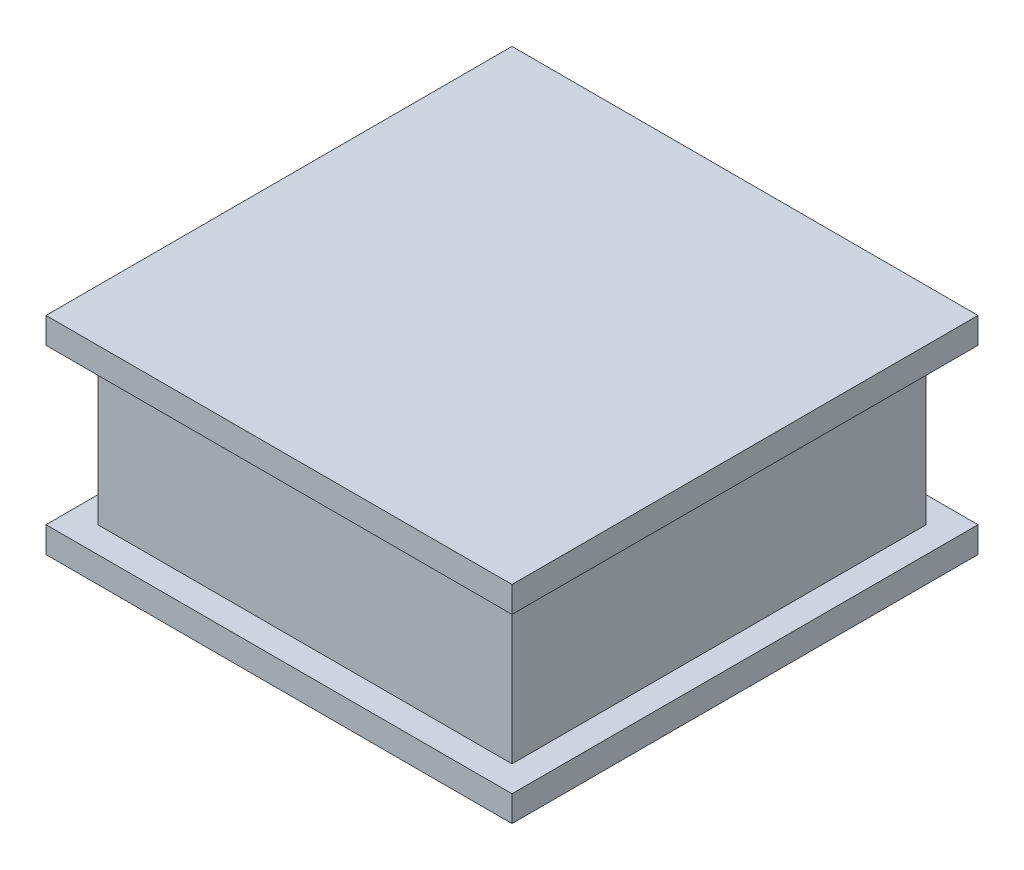
ISO-10303-21;
HEADER;
FILE_DESCRIPTION(('STEP AP214'),'2;1');
FILE_NAME('part.step','',(''),(''),'','','');
FILE_SCHEMA(('AUTOMOTIVE_DESIGN { 1 0 10303 214 1 1 1 1 }'));
ENDSEC;
DATA;
#1=APPLICATION_CONTEXT('core data for automotive mechanical design processes');
#2=APPLICATION_PROTOCOL_DEFINITION('international standard','automotive_design',2000,#1);
#3=PRODUCT_CONTEXT('',#1,'mechanical');
#4=PRODUCT('Part','Part','',(#3));
#5=PRODUCT_RELATED_PRODUCT_CATEGORY('part','',(#4));
#6=PRODUCT_DEFINITION_FORMATION('','',#4);
#7=PRODUCT_DEFINITION_CONTEXT('part definition',#1,'design');
#8=PRODUCT_DEFINITION('design','',#6,#7);
#9=PRODUCT_DEFINITION_SHAPE('','',#8);
#10=(LENGTH_UNIT() NAMED_UNIT(*) SI_UNIT(.MILLI.,.METRE.));
#11=(NAMED_UNIT(*) PLANE_ANGLE_UNIT() SI_UNIT($,.RADIAN.));
#12=(NAMED_UNIT(*) SI_UNIT($,.STERADIAN.) SOLID_ANGLE_UNIT());
#13=UNCERTAINTY_MEASURE_WITH_UNIT(LENGTH_MEASURE(1.E-05),#10,'distance_accuracy_value','');
#14=(GEOMETRIC_REPRESENTATION_CONTEXT(3) GLOBAL_UNCERTAINTY_ASSIGNED_CONTEXT((#13)) GLOBAL_UNIT_ASSIGNED_CONTEXT((#10,
#11,#12)) REPRESENTATION_CONTEXT('',''));
#15=CARTESIAN_POINT('',(0.,0.,0.));
#16=DIRECTION('',(0.,0.,1.));
#17=DIRECTION('',(1.,0.,0.));
#18=AXIS2_PLACEMENT_3D('',#15,#16,#17);
#19=CARTESIAN_POINT('',(8.,3.,8.));
#20=DIRECTION('',(-1.,0.,0.));
#21=DIRECTION('',(0.,0.,1.));
#22=AXIS2_PLACEMENT_3D('',#19,#20,#21);
#23=PLANE('',#22);
#24=DIRECTION('',(0.,0.,-1.));
#25=VECTOR('',#24,1.);
#26=CARTESIAN_POINT('',(8.,-3.,8.));
#27=LINE('',#26,#25);
#28=CARTESIAN_POINT('',(8.,-3.,8.));
#29=VERTEX_POINT('',#28);
#30=CARTESIAN_POINT('',(8.,-3.,-8.));
#31=VERTEX_POINT('',#30);
#32=EDGE_CURVE('E194',#29,#31,#27,.T.);
#33=ORIENTED_EDGE('',*,*,#32,.T.);
#34=DIRECTION('',(0.,-1.,0.));
#35=VECTOR('',#34,1.);
#36=CARTESIAN_POINT('',(8.,3.,-8.));
#37=LINE('',#36,#35);
#38=CARTESIAN_POINT('',(8.,3.,-8.));
#39=VERTEX_POINT('',#38);
#40=EDGE_CURVE('E11',#39,#31,#37,.T.);
#41=ORIENTED_EDGE('',*,*,#40,.F.);
#42=DIRECTION('',(0.,0.,-1.));
#43=VECTOR('',#42,1.);
#44=CARTESIAN_POINT('',(8.,3.,8.));
#45=LINE('',#44,#43);
#46=CARTESIAN_POINT('',(8.,3.,8.));
#47=VERTEX_POINT('',#46);
#48=EDGE_CURVE('E195',#47,#39,#45,.T.);
#49=ORIENTED_EDGE('',*,*,#48,.F.);
#50=DIRECTION('',(0.,-1.,0.));
#51=VECTOR('',#50,1.);
#52=CARTESIAN_POINT('',(8.,3.,8.));
#53=LINE('',#52,#51);
#54=EDGE_CURVE('E208',#47,#29,#53,.T.);
#55=ORIENTED_EDGE('',*,*,#54,.T.);
#56=EDGE_LOOP('',(#33,#41,#49,#55));
#57=FACE_BOUND('',#56,.T.);
#58=ADVANCED_FACE('F37',(#57),#23,.F.);
#59=CARTESIAN_POINT('',(-8.,3.,-8.));
#60=DIRECTION('',(0.,0.,1.));
#61=DIRECTION('',(1.,0.,0.));
#62=AXIS2_PLACEMENT_3D('',#59,#60,#61);
#63=PLANE('',#62);
#64=DIRECTION('',(-1.,0.,0.));
#65=VECTOR('',#64,1.);
#66=CARTESIAN_POINT('',(-8.,-3.,-8.));
#67=LINE('',#66,#65);
#68=CARTESIAN_POINT('',(-8.,-3.,-8.));
#69=VERTEX_POINT('',#68);
#70=EDGE_CURVE('E211',#31,#69,#67,.T.);
#71=ORIENTED_EDGE('',*,*,#70,.T.);
#72=DIRECTION('',(0.,-1.,0.));
#73=VECTOR('',#72,1.);
#74=CARTESIAN_POINT('',(-8.,3.,-8.));
#75=LINE('',#74,#73);
#76=CARTESIAN_POINT('',(-8.,3.,-8.));
#77=VERTEX_POINT('',#76);
#78=EDGE_CURVE('E45',#77,#69,#75,.T.);
#79=ORIENTED_EDGE('',*,*,#78,.F.);
#80=DIRECTION('',(-1.,0.,0.));
#81=VECTOR('',#80,1.);
#82=CARTESIAN_POINT('',(-8.,3.,-8.));
#83=LINE('',#82,#81);
#84=EDGE_CURVE('E198',#39,#77,#83,.T.);
#85=ORIENTED_EDGE('',*,*,#84,.F.);
#86=ORIENTED_EDGE('',*,*,#40,.T.);
#87=EDGE_LOOP('',(#71,#79,#85,#86));
#88=FACE_BOUND('',#87,.T.);
#89=ADVANCED_FACE('F224',(#88),#63,.F.);
#90=CARTESIAN_POINT('',(-8.,3.,8.));
#91=DIRECTION('',(1.,0.,0.));
#92=DIRECTION('',(0.,0.,-1.));
#93=AXIS2_PLACEMENT_3D('',#90,#91,#92);
#94=PLANE('',#93);
#95=DIRECTION('',(0.,0.,1.));
#96=VECTOR('',#95,1.);
#97=CARTESIAN_POINT('',(-8.,-3.,8.));
#98=LINE('',#97,#96);
#99=CARTESIAN_POINT('',(-8.,-3.,8.));
#100=VERTEX_POINT('',#99);
#101=EDGE_CURVE('E214',#69,#100,#98,.T.);
#102=ORIENTED_EDGE('',*,*,#101,.T.);
#103=DIRECTION('',(0.,-1.,0.));
#104=VECTOR('',#103,1.);
#105=CARTESIAN_POINT('',(-8.,3.,8.));
#106=LINE('',#105,#104);
#107=CARTESIAN_POINT('',(-8.,3.,8.));
#108=VERTEX_POINT('',#107);
#109=EDGE_CURVE('E52',#108,#100,#106,.T.);
#110=ORIENTED_EDGE('',*,*,#109,.F.);
#111=DIRECTION('',(0.,0.,1.));
#112=VECTOR('',#111,1.);
#113=CARTESIAN_POINT('',(-8.,3.,8.));
#114=LINE('',#113,#112);
#115=EDGE_CURVE('E202',#77,#108,#114,.T.);
#116=ORIENTED_EDGE('',*,*,#115,.F.);
#117=ORIENTED_EDGE('',*,*,#78,.T.);
#118=EDGE_LOOP('',(#102,#110,#116,#117));
#119=FACE_BOUND('',#118,.T.);
#120=ADVANCED_FACE('F221',(#119),#94,.F.);
#121=CARTESIAN_POINT('',(-8.,3.,8.));
#122=DIRECTION('',(0.,0.,-1.));
#123=DIRECTION('',(-1.,0.,0.));
#124=AXIS2_PLACEMENT_3D('',#121,#122,#123);
#125=PLANE('',#124);
#126=DIRECTION('',(1.,0.,0.));
#127=VECTOR('',#126,1.);
#128=CARTESIAN_POINT('',(-8.,-3.,8.));
#129=LINE('',#128,#127);
#130=EDGE_CURVE('E199',#100,#29,#129,.T.);
#131=ORIENTED_EDGE('',*,*,#130,.T.);
#132=ORIENTED_EDGE('',*,*,#54,.F.);
#133=DIRECTION('',(1.,0.,0.));
#134=VECTOR('',#133,1.);
#135=CARTESIAN_POINT('',(-8.,3.,8.));
#136=LINE('',#135,#134);
#137=EDGE_CURVE('E205',#108,#47,#136,.T.);
#138=ORIENTED_EDGE('',*,*,#137,.F.);
#139=ORIENTED_EDGE('',*,*,#109,.T.);
#140=EDGE_LOOP('',(#131,#132,#138,#139));
#141=FACE_BOUND('',#140,.T.);
#142=ADVANCED_FACE('F230',(#141),#125,.F.);
#143=CARTESIAN_POINT('',(9.,4.,9.));
#144=DIRECTION('',(-1.,0.,0.));
#145=DIRECTION('',(0.,0.,1.));
#146=AXIS2_PLACEMENT_3D('',#143,#144,#145);
#147=PLANE('',#146);
#148=DIRECTION('',(0.,0.,-1.));
#149=VECTOR('',#148,1.);
#150=CARTESIAN_POINT('',(9.,3.,9.));
#151=LINE('',#150,#149);
#152=CARTESIAN_POINT('',(9.,3.,9.));
#153=VERTEX_POINT('',#152);
#154=CARTESIAN_POINT('',(9.,3.,-9.));
#155=VERTEX_POINT('',#154);
#156=EDGE_CURVE('E133',#153,#155,#151,.T.);
#157=ORIENTED_EDGE('',*,*,#156,.T.);
#158=DIRECTION('',(0.,-1.,0.));
#159=VECTOR('',#158,1.);
#160=CARTESIAN_POINT('',(9.,4.,-9.));
#161=LINE('',#160,#159);
#162=CARTESIAN_POINT('',(9.,4.,-9.));
#163=VERTEX_POINT('',#162);
#164=EDGE_CURVE('E191',#163,#155,#161,.T.);
#165=ORIENTED_EDGE('',*,*,#164,.F.);
#166=DIRECTION('',(0.,0.,-1.));
#167=VECTOR('',#166,1.);
#168=CARTESIAN_POINT('',(9.,4.,9.));
#169=LINE('',#168,#167);
#170=CARTESIAN_POINT('',(9.,4.,9.));
#171=VERTEX_POINT('',#170);
#172=EDGE_CURVE('E165',#171,#163,#169,.T.);
#173=ORIENTED_EDGE('',*,*,#172,.F.);
#174=DIRECTION('',(0.,-1.,0.));
#175=VECTOR('',#174,1.);
#176=CARTESIAN_POINT('',(9.,4.,9.));
#177=LINE('',#176,#175);
#178=EDGE_CURVE('E175',#171,#153,#177,.T.);
#179=ORIENTED_EDGE('',*,*,#178,.T.);
#180=EDGE_LOOP('',(#157,#165,#173,#179));
#181=FACE_BOUND('',#180,.T.);
#182=ADVANCED_FACE('F243',(#181),#147,.F.);
#183=CARTESIAN_POINT('',(-9.,4.,-9.));
#184=DIRECTION('',(0.,0.,1.));
#185=DIRECTION('',(1.,0.,0.));
#186=AXIS2_PLACEMENT_3D('',#183,#184,#185);
#187=PLANE('',#186);
#188=DIRECTION('',(-1.,0.,0.));
#189=VECTOR('',#188,1.);
#190=CARTESIAN_POINT('',(-9.,3.,-9.));
#191=LINE('',#190,#189);
#192=CARTESIAN_POINT('',(-9.,3.,-9.));
#193=VERTEX_POINT('',#192);
#194=EDGE_CURVE('E178',#155,#193,#191,.T.);
#195=ORIENTED_EDGE('',*,*,#194,.T.);
#196=DIRECTION('',(0.,-1.,0.));
#197=VECTOR('',#196,1.);
#198=CARTESIAN_POINT('',(-9.,4.,-9.));
#199=LINE('',#198,#197);
#200=CARTESIAN_POINT('',(-9.,4.,-9.));
#201=VERTEX_POINT('',#200);
#202=EDGE_CURVE('E188',#201,#193,#199,.T.);
#203=ORIENTED_EDGE('',*,*,#202,.F.);
#204=DIRECTION('',(-1.,0.,0.));
#205=VECTOR('',#204,1.);
#206=CARTESIAN_POINT('',(-9.,4.,-9.));
#207=LINE('',#206,#205);
#208=EDGE_CURVE('E168',#163,#201,#207,.T.);
#209=ORIENTED_EDGE('',*,*,#208,.F.);
#210=ORIENTED_EDGE('',*,*,#164,.T.);
#211=EDGE_LOOP('',(#195,#203,#209,#210));
#212=FACE_BOUND('',#211,.T.);
#213=ADVANCED_FACE('F255',(#212),#187,.F.);
#214=CARTESIAN_POINT('',(-9.,4.,9.));
#215=DIRECTION('',(1.,0.,0.));
#216=DIRECTION('',(0.,0.,-1.));
#217=AXIS2_PLACEMENT_3D('',#214,#215,#216);
#218=PLANE('',#217);
#219=DIRECTION('',(0.,0.,1.));
#220=VECTOR('',#219,1.);
#221=CARTESIAN_POINT('',(-9.,3.,9.));
#222=LINE('',#221,#220);
#223=CARTESIAN_POINT('',(-9.,3.,9.));
#224=VERTEX_POINT('',#223);
#225=EDGE_CURVE('E180',#193,#224,#222,.T.);
#226=ORIENTED_EDGE('',*,*,#225,.T.);
#227=DIRECTION('',(0.,-1.,0.));
#228=VECTOR('',#227,1.);
#229=CARTESIAN_POINT('',(-9.,4.,9.));
#230=LINE('',#229,#228);
#231=CARTESIAN_POINT('',(-9.,4.,9.));
#232=VERTEX_POINT('',#231);
#233=EDGE_CURVE('E185',#232,#224,#230,.T.);
#234=ORIENTED_EDGE('',*,*,#233,.F.);
#235=DIRECTION('',(0.,0.,1.));
#236=VECTOR('',#235,1.);
#237=CARTESIAN_POINT('',(-9.,4.,9.));
#238=LINE('',#237,#236);
#239=EDGE_CURVE('E171',#201,#232,#238,.T.);
#240=ORIENTED_EDGE('',*,*,#239,.F.);
#241=ORIENTED_EDGE('',*,*,#202,.T.);
#242=EDGE_LOOP('',(#226,#234,#240,#241));
#243=FACE_BOUND('',#242,.T.);
#244=ADVANCED_FACE('F252',(#243),#218,.F.);
#245=CARTESIAN_POINT('',(-9.,4.,9.));
#246=DIRECTION('',(0.,0.,-1.));
#247=DIRECTION('',(-1.,0.,0.));
#248=AXIS2_PLACEMENT_3D('',#245,#246,#247);
#249=PLANE('',#248);
#250=DIRECTION('',(1.,0.,0.));
#251=VECTOR('',#250,1.);
#252=CARTESIAN_POINT('',(-9.,3.,9.));
#253=LINE('',#252,#251);
#254=EDGE_CURVE('E169',#224,#153,#253,.T.);
#255=ORIENTED_EDGE('',*,*,#254,.T.);
#256=ORIENTED_EDGE('',*,*,#178,.F.);
#257=DIRECTION('',(1.,0.,0.));
#258=VECTOR('',#257,1.);
#259=CARTESIAN_POINT('',(-9.,4.,9.));
#260=LINE('',#259,#258);
#261=EDGE_CURVE('E173',#232,#171,#260,.T.);
#262=ORIENTED_EDGE('',*,*,#261,.F.);
#263=ORIENTED_EDGE('',*,*,#233,.T.);
#264=EDGE_LOOP('',(#255,#256,#262,#263));
#265=FACE_BOUND('',#264,.T.);
#266=ADVANCED_FACE('F248',(#265),#249,.F.);
#267=CARTESIAN_POINT('',(0.,4.,0.));
#268=DIRECTION('',(0.,-1.,0.));
#269=DIRECTION('',(0.,0.,-1.));
#270=AXIS2_PLACEMENT_3D('',#267,#268,#269);
#271=PLANE('',#270);
#272=ORIENTED_EDGE('',*,*,#172,.T.);
#273=ORIENTED_EDGE('',*,*,#208,.T.);
#274=ORIENTED_EDGE('',*,*,#239,.T.);
#275=ORIENTED_EDGE('',*,*,#261,.T.);
#276=EDGE_LOOP('',(#272,#273,#274,#275));
#277=FACE_BOUND('',#276,.T.);
#278=ADVANCED_FACE('F236',(#277),#271,.F.);
#279=CARTESIAN_POINT('',(0.,3.,0.));
#280=DIRECTION('',(0.,-1.,0.));
#281=DIRECTION('',(0.,0.,-1.));
#282=AXIS2_PLACEMENT_3D('',#279,#280,#281);
#283=PLANE('',#282);
#284=ORIENTED_EDGE('',*,*,#137,.T.);
#285=ORIENTED_EDGE('',*,*,#48,.T.);
#286=ORIENTED_EDGE('',*,*,#84,.T.);
#287=ORIENTED_EDGE('',*,*,#115,.T.);
#288=EDGE_LOOP('',(#284,#285,#286,#287));
#289=FACE_BOUND('',#288,.T.);
#290=ORIENTED_EDGE('',*,*,#156,.F.);
#291=ORIENTED_EDGE('',*,*,#254,.F.);
#292=ORIENTED_EDGE('',*,*,#225,.F.);
#293=ORIENTED_EDGE('',*,*,#194,.F.);
#294=EDGE_LOOP('',(#290,#291,#292,#293));
#295=FACE_BOUND('',#294,.T.);
#296=ADVANCED_FACE('F233',(#289,#295),#283,.T.);
#297=CARTESIAN_POINT('',(0.,-3.,0.));
#298=DIRECTION('',(0.,1.,0.));
#299=DIRECTION('',(0.,0.,-1.));
#300=AXIS2_PLACEMENT_3D('',#297,#298,#299);
#301=PLANE('',#300);
#302=DIRECTION('',(0.,0.,-1.));
#303=VECTOR('',#302,1.);
#304=CARTESIAN_POINT('',(9.,-3.,9.));
#305=LINE('',#304,#303);
#306=CARTESIAN_POINT('',(9.,-3.,9.));
#307=VERTEX_POINT('',#306);
#308=CARTESIAN_POINT('',(9.,-3.,-9.));
#309=VERTEX_POINT('',#308);
#310=EDGE_CURVE('E128',#307,#309,#305,.T.);
#311=ORIENTED_EDGE('',*,*,#310,.T.);
#312=DIRECTION('',(-1.,0.,0.));
#313=VECTOR('',#312,1.);
#314=CARTESIAN_POINT('',(-9.,-3.,-9.));
#315=LINE('',#314,#313);
#316=CARTESIAN_POINT('',(-9.,-3.,-9.));
#317=VERTEX_POINT('',#316);
#318=EDGE_CURVE('E144',#309,#317,#315,.T.);
#319=ORIENTED_EDGE('',*,*,#318,.T.);
#320=DIRECTION('',(0.,0.,1.));
#321=VECTOR('',#320,1.);
#322=CARTESIAN_POINT('',(-9.,-3.,9.));
#323=LINE('',#322,#321);
#324=CARTESIAN_POINT('',(-9.,-3.,9.));
#325=VERTEX_POINT('',#324);
#326=EDGE_CURVE('E156',#317,#325,#323,.T.);
#327=ORIENTED_EDGE('',*,*,#326,.T.);
#328=DIRECTION('',(1.,0.,0.));
#329=VECTOR('',#328,1.);
#330=CARTESIAN_POINT('',(-9.,-3.,9.));
#331=LINE('',#330,#329);
#332=EDGE_CURVE('E154',#325,#307,#331,.T.);
#333=ORIENTED_EDGE('',*,*,#332,.T.);
#334=EDGE_LOOP('',(#311,#319,#327,#333));
#335=FACE_BOUND('',#334,.T.);
#336=ORIENTED_EDGE('',*,*,#32,.F.);
#337=ORIENTED_EDGE('',*,*,#130,.F.);
#338=ORIENTED_EDGE('',*,*,#101,.F.);
#339=ORIENTED_EDGE('',*,*,#70,.F.);
#340=EDGE_LOOP('',(#336,#337,#338,#339));
#341=FACE_BOUND('',#340,.T.);
#342=ADVANCED_FACE('F227',(#335,#341),#301,.T.);
#343=CARTESIAN_POINT('',(9.,-4.,9.));
#344=DIRECTION('',(1.,0.,0.));
#345=DIRECTION('',(0.,0.,-1.));
#346=AXIS2_PLACEMENT_3D('',#343,#344,#345);
#347=PLANE('',#346);
#348=ORIENTED_EDGE('',*,*,#310,.F.);
#349=DIRECTION('',(0.,1.,0.));
#350=VECTOR('',#349,1.);
#351=CARTESIAN_POINT('',(9.,-4.,9.));
#352=LINE('',#351,#350);
#353=CARTESIAN_POINT('',(9.,-4.,9.));
#354=VERTEX_POINT('',#353);
#355=EDGE_CURVE('E122',#354,#307,#352,.T.);
#356=ORIENTED_EDGE('',*,*,#355,.F.);
#357=DIRECTION('',(0.,0.,-1.));
#358=VECTOR('',#357,1.);
#359=CARTESIAN_POINT('',(9.,-4.,9.));
#360=LINE('',#359,#358);
#361=CARTESIAN_POINT('',(9.,-4.,-9.));
#362=VERTEX_POINT('',#361);
#363=EDGE_CURVE('E125',#354,#362,#360,.T.);
#364=ORIENTED_EDGE('',*,*,#363,.T.);
#365=DIRECTION('',(0.,1.,0.));
#366=VECTOR('',#365,1.);
#367=CARTESIAN_POINT('',(9.,-4.,-9.));
#368=LINE('',#367,#366);
#369=EDGE_CURVE('E152',#362,#309,#368,.T.);
#370=ORIENTED_EDGE('',*,*,#369,.T.);
#371=EDGE_LOOP('',(#348,#356,#364,#370));
#372=FACE_BOUND('',#371,.T.);
#373=ADVANCED_FACE('F124',(#372),#347,.T.);
#374=CARTESIAN_POINT('',(-9.,-4.,9.));
#375=DIRECTION('',(0.,0.,1.));
#376=DIRECTION('',(1.,0.,0.));
#377=AXIS2_PLACEMENT_3D('',#374,#375,#376);
#378=PLANE('',#377);
#379=ORIENTED_EDGE('',*,*,#332,.F.);
#380=DIRECTION('',(0.,1.,0.));
#381=VECTOR('',#380,1.);
#382=CARTESIAN_POINT('',(-9.,-4.,9.));
#383=LINE('',#382,#381);
#384=CARTESIAN_POINT('',(-9.,-4.,9.));
#385=VERTEX_POINT('',#384);
#386=EDGE_CURVE('E134',#385,#325,#383,.T.);
#387=ORIENTED_EDGE('',*,*,#386,.F.);
#388=DIRECTION('',(1.,0.,0.));
#389=VECTOR('',#388,1.);
#390=CARTESIAN_POINT('',(-9.,-4.,9.));
#391=LINE('',#390,#389);
#392=EDGE_CURVE('E140',#385,#354,#391,.T.);
#393=ORIENTED_EDGE('',*,*,#392,.T.);
#394=ORIENTED_EDGE('',*,*,#355,.T.);
#395=EDGE_LOOP('',(#379,#387,#393,#394));
#396=FACE_BOUND('',#395,.T.);
#397=ADVANCED_FACE('F146',(#396),#378,.T.);
#398=CARTESIAN_POINT('',(-9.,-4.,9.));
#399=DIRECTION('',(-1.,0.,0.));
#400=DIRECTION('',(0.,0.,1.));
#401=AXIS2_PLACEMENT_3D('',#398,#399,#400);
#402=PLANE('',#401);
#403=ORIENTED_EDGE('',*,*,#326,.F.);
#404=DIRECTION('',(0.,1.,0.));
#405=VECTOR('',#404,1.);
#406=CARTESIAN_POINT('',(-9.,-4.,-9.));
#407=LINE('',#406,#405);
#408=CARTESIAN_POINT('',(-9.,-4.,-9.));
#409=VERTEX_POINT('',#408);
#410=EDGE_CURVE('E162',#409,#317,#407,.T.);
#411=ORIENTED_EDGE('',*,*,#410,.F.);
#412=DIRECTION('',(0.,0.,1.));
#413=VECTOR('',#412,1.);
#414=CARTESIAN_POINT('',(-9.,-4.,9.));
#415=LINE('',#414,#413);
#416=EDGE_CURVE('E147',#409,#385,#415,.T.);
#417=ORIENTED_EDGE('',*,*,#416,.T.);
#418=ORIENTED_EDGE('',*,*,#386,.T.);
#419=EDGE_LOOP('',(#403,#411,#417,#418));
#420=FACE_BOUND('',#419,.T.);
#421=ADVANCED_FACE('F353',(#420),#402,.T.);
#422=CARTESIAN_POINT('',(-9.,-4.,-9.));
#423=DIRECTION('',(0.,0.,-1.));
#424=DIRECTION('',(-1.,0.,0.));
#425=AXIS2_PLACEMENT_3D('',#422,#423,#424);
#426=PLANE('',#425);
#427=ORIENTED_EDGE('',*,*,#318,.F.);
#428=ORIENTED_EDGE('',*,*,#369,.F.);
#429=DIRECTION('',(-1.,0.,0.));
#430=VECTOR('',#429,1.);
#431=CARTESIAN_POINT('',(-9.,-4.,-9.));
#432=LINE('',#431,#430);
#433=EDGE_CURVE('E143',#362,#409,#432,.T.);
#434=ORIENTED_EDGE('',*,*,#433,.T.);
#435=ORIENTED_EDGE('',*,*,#410,.T.);
#436=EDGE_LOOP('',(#427,#428,#434,#435));
#437=FACE_BOUND('',#436,.T.);
#438=ADVANCED_FACE('F363',(#437),#426,.T.);
#439=CARTESIAN_POINT('',(0.,-4.,0.));
#440=DIRECTION('',(0.,1.,0.));
#441=DIRECTION('',(0.,0.,-1.));
#442=AXIS2_PLACEMENT_3D('',#439,#440,#441);
#443=PLANE('',#442);
#444=ORIENTED_EDGE('',*,*,#363,.F.);
#445=ORIENTED_EDGE('',*,*,#392,.F.);
#446=ORIENTED_EDGE('',*,*,#416,.F.);
#447=ORIENTED_EDGE('',*,*,#433,.F.);
#448=EDGE_LOOP('',(#444,#445,#446,#447));
#449=FACE_BOUND('',#448,.T.);
#450=ADVANCED_FACE('F138',(#449),#443,.F.);
#451=CLOSED_SHELL('',(#58,#89,#120,#142,#182,#213,#244,#266,#278,#296,#342,#373,#397,#421,#438,#450));
#452=MANIFOLD_SOLID_BREP('B2',#451);
#453=ADVANCED_BREP_SHAPE_REPRESENTATION('',(#18,#452),#14);
#454=SHAPE_DEFINITION_REPRESENTATION(#9,#453);
ENDSEC;
END-ISO-10303-21;
